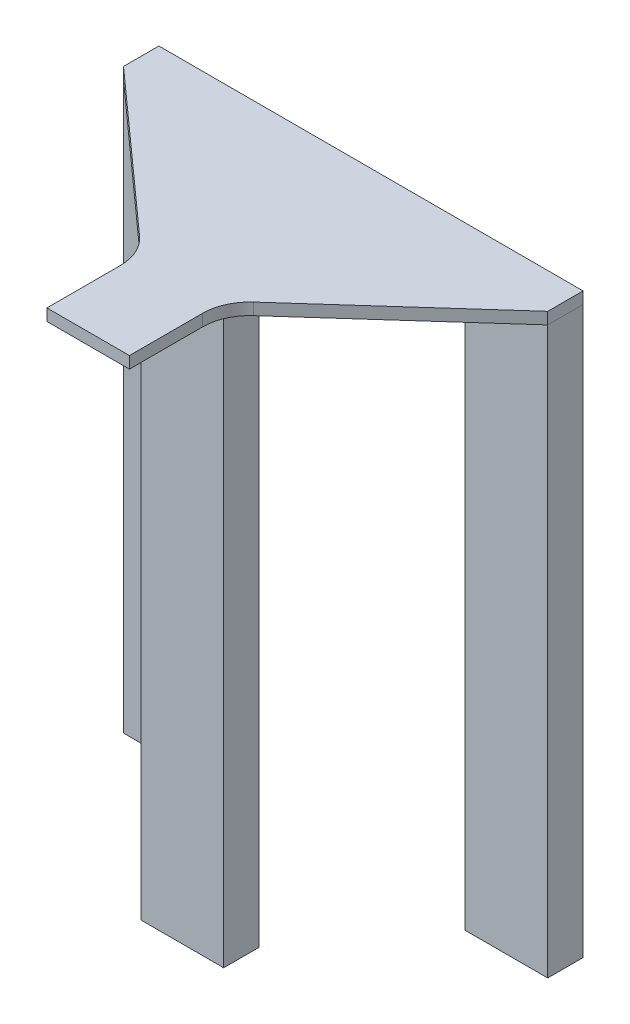
ISO-10303-21;
HEADER;
FILE_DESCRIPTION(('STEP AP214'),'2;1');
FILE_NAME('part.step','',(''),(''),'','','');
FILE_SCHEMA(('AUTOMOTIVE_DESIGN { 1 0 10303 214 1 1 1 1 }'));
ENDSEC;
DATA;
#1=APPLICATION_CONTEXT('core data for automotive mechanical design processes');
#2=APPLICATION_PROTOCOL_DEFINITION('international standard','automotive_design',2000,#1);
#3=PRODUCT_CONTEXT('',#1,'mechanical');
#4=PRODUCT('Part','Part','',(#3));
#5=PRODUCT_RELATED_PRODUCT_CATEGORY('part','',(#4));
#6=PRODUCT_DEFINITION_FORMATION('','',#4);
#7=PRODUCT_DEFINITION_CONTEXT('part definition',#1,'design');
#8=PRODUCT_DEFINITION('design','',#6,#7);
#9=PRODUCT_DEFINITION_SHAPE('','',#8);
#10=(LENGTH_UNIT() NAMED_UNIT(*) SI_UNIT(.MILLI.,.METRE.));
#11=(NAMED_UNIT(*) PLANE_ANGLE_UNIT() SI_UNIT($,.RADIAN.));
#12=(NAMED_UNIT(*) SI_UNIT($,.STERADIAN.) SOLID_ANGLE_UNIT());
#13=UNCERTAINTY_MEASURE_WITH_UNIT(LENGTH_MEASURE(1.E-05),#10,'distance_accuracy_value','');
#14=(GEOMETRIC_REPRESENTATION_CONTEXT(3) GLOBAL_UNCERTAINTY_ASSIGNED_CONTEXT((#13)) GLOBAL_UNIT_ASSIGNED_CONTEXT((#10,
#11,#12)) REPRESENTATION_CONTEXT('',''));
#15=CARTESIAN_POINT('',(0.,0.,0.));
#16=DIRECTION('',(0.,0.,1.));
#17=DIRECTION('',(1.,0.,0.));
#18=AXIS2_PLACEMENT_3D('',#15,#16,#17);
#19=CARTESIAN_POINT('',(0.,-609.6,-304.8));
#20=DIRECTION('',(0.,0.,1.));
#21=DIRECTION('',(1.,0.,0.));
#22=AXIS2_PLACEMENT_3D('',#19,#20,#21);
#23=PLANE('',#22);
#24=DIRECTION('',(1.,0.,0.));
#25=VECTOR('',#24,1.);
#26=CARTESIAN_POINT('',(0.,0.,-304.8));
#27=LINE('',#26,#25);
#28=CARTESIAN_POINT('',(139.7,0.,-304.8));
#29=VERTEX_POINT('',#28);
#30=CARTESIAN_POINT('',(228.6,0.,-304.8));
#31=VERTEX_POINT('',#30);
#32=EDGE_CURVE('E119',#29,#31,#27,.T.);
#33=ORIENTED_EDGE('',*,*,#32,.T.);
#34=DIRECTION('',(0.,1.,0.));
#35=VECTOR('',#34,1.);
#36=CARTESIAN_POINT('',(228.6,-609.6,-304.8));
#37=LINE('',#36,#35);
#38=CARTESIAN_POINT('',(228.6,-609.6,-304.8));
#39=VERTEX_POINT('',#38);
#40=EDGE_CURVE('E12',#39,#31,#37,.T.);
#41=ORIENTED_EDGE('',*,*,#40,.F.);
#42=DIRECTION('',(1.,0.,0.));
#43=VECTOR('',#42,1.);
#44=CARTESIAN_POINT('',(0.,-609.6,-304.8));
#45=LINE('',#44,#43);
#46=CARTESIAN_POINT('',(139.7,-609.6,-304.8));
#47=VERTEX_POINT('',#46);
#48=EDGE_CURVE('E112',#47,#39,#45,.T.);
#49=ORIENTED_EDGE('',*,*,#48,.F.);
#50=DIRECTION('',(0.,1.,0.));
#51=VECTOR('',#50,1.);
#52=CARTESIAN_POINT('',(139.7,-609.6,-304.8));
#53=LINE('',#52,#51);
#54=EDGE_CURVE('E54',#47,#29,#53,.T.);
#55=ORIENTED_EDGE('',*,*,#54,.T.);
#56=EDGE_LOOP('',(#33,#41,#49,#55));
#57=FACE_BOUND('',#56,.T.);
#58=ADVANCED_FACE('F55',(#57),#23,.F.);
#59=CARTESIAN_POINT('',(228.6,-609.6,0.));
#60=DIRECTION('',(-1.,0.,0.));
#61=DIRECTION('',(0.,0.,1.));
#62=AXIS2_PLACEMENT_3D('',#59,#60,#61);
#63=PLANE('',#62);
#64=DIRECTION('',(0.,0.,1.));
#65=VECTOR('',#64,1.);
#66=CARTESIAN_POINT('',(228.6,0.,0.));
#67=LINE('',#66,#65);
#68=CARTESIAN_POINT('',(228.6,0.,-266.7));
#69=VERTEX_POINT('',#68);
#70=EDGE_CURVE('E82',#31,#69,#67,.T.);
#71=ORIENTED_EDGE('',*,*,#70,.T.);
#72=DIRECTION('',(0.,1.,0.));
#73=VECTOR('',#72,1.);
#74=CARTESIAN_POINT('',(228.6,-609.6,-266.7));
#75=LINE('',#74,#73);
#76=CARTESIAN_POINT('',(228.6,-609.6,-266.7));
#77=VERTEX_POINT('',#76);
#78=EDGE_CURVE('E64',#77,#69,#75,.T.);
#79=ORIENTED_EDGE('',*,*,#78,.F.);
#80=DIRECTION('',(0.,0.,1.));
#81=VECTOR('',#80,1.);
#82=CARTESIAN_POINT('',(228.6,-609.6,0.));
#83=LINE('',#82,#81);
#84=EDGE_CURVE('E70',#39,#77,#83,.T.);
#85=ORIENTED_EDGE('',*,*,#84,.F.);
#86=ORIENTED_EDGE('',*,*,#40,.T.);
#87=EDGE_LOOP('',(#71,#79,#85,#86));
#88=FACE_BOUND('',#87,.T.);
#89=ADVANCED_FACE('F127',(#88),#63,.F.);
#90=CARTESIAN_POINT('',(-1.66533453693773E-13,-609.6,-266.7));
#91=DIRECTION('',(0.,0.,-1.));
#92=DIRECTION('',(-1.,0.,0.));
#93=AXIS2_PLACEMENT_3D('',#90,#91,#92);
#94=PLANE('',#93);
#95=DIRECTION('',(-1.,0.,0.));
#96=VECTOR('',#95,1.);
#97=CARTESIAN_POINT('',(-1.66533453693773E-13,0.,-266.7));
#98=LINE('',#97,#96);
#99=CARTESIAN_POINT('',(139.7,0.,-266.7));
#100=VERTEX_POINT('',#99);
#101=EDGE_CURVE('E107',#69,#100,#98,.T.);
#102=ORIENTED_EDGE('',*,*,#101,.T.);
#103=DIRECTION('',(0.,1.,0.));
#104=VECTOR('',#103,1.);
#105=CARTESIAN_POINT('',(139.7,-609.6,-266.7));
#106=LINE('',#105,#104);
#107=CARTESIAN_POINT('',(139.7,-609.6,-266.7));
#108=VERTEX_POINT('',#107);
#109=EDGE_CURVE('E106',#108,#100,#106,.T.);
#110=ORIENTED_EDGE('',*,*,#109,.F.);
#111=DIRECTION('',(-1.,0.,0.));
#112=VECTOR('',#111,1.);
#113=CARTESIAN_POINT('',(-1.66533453693773E-13,-609.6,-266.7));
#114=LINE('',#113,#112);
#115=EDGE_CURVE('E97',#77,#108,#114,.T.);
#116=ORIENTED_EDGE('',*,*,#115,.F.);
#117=ORIENTED_EDGE('',*,*,#78,.T.);
#118=EDGE_LOOP('',(#102,#110,#116,#117));
#119=FACE_BOUND('',#118,.T.);
#120=ADVANCED_FACE('F110',(#119),#94,.F.);
#121=CARTESIAN_POINT('',(139.7,-609.6,0.));
#122=DIRECTION('',(-1.,0.,0.));
#123=DIRECTION('',(0.,0.,1.));
#124=AXIS2_PLACEMENT_3D('',#121,#122,#123);
#125=PLANE('',#124);
#126=DIRECTION('',(0.,0.,1.));
#127=VECTOR('',#126,1.);
#128=CARTESIAN_POINT('',(139.7,0.,0.));
#129=LINE('',#128,#127);
#130=EDGE_CURVE('E118',#29,#100,#129,.T.);
#131=ORIENTED_EDGE('',*,*,#130,.F.);
#132=ORIENTED_EDGE('',*,*,#54,.F.);
#133=DIRECTION('',(0.,0.,1.));
#134=VECTOR('',#133,1.);
#135=CARTESIAN_POINT('',(139.7,-609.6,0.));
#136=LINE('',#135,#134);
#137=EDGE_CURVE('E105',#47,#108,#136,.T.);
#138=ORIENTED_EDGE('',*,*,#137,.T.);
#139=ORIENTED_EDGE('',*,*,#109,.T.);
#140=EDGE_LOOP('',(#131,#132,#138,#139));
#141=FACE_BOUND('',#140,.T.);
#142=ADVANCED_FACE('F109',(#141),#125,.T.);
#143=CARTESIAN_POINT('',(0.,-609.6,0.));
#144=DIRECTION('',(0.,1.,0.));
#145=DIRECTION('',(0.,0.,1.));
#146=AXIS2_PLACEMENT_3D('',#143,#144,#145);
#147=PLANE('',#146);
#148=ORIENTED_EDGE('',*,*,#48,.T.);
#149=ORIENTED_EDGE('',*,*,#84,.T.);
#150=ORIENTED_EDGE('',*,*,#115,.T.);
#151=ORIENTED_EDGE('',*,*,#137,.F.);
#152=EDGE_LOOP('',(#148,#149,#150,#151));
#153=FACE_BOUND('',#152,.T.);
#154=ADVANCED_FACE('F101',(#153),#147,.F.);
#155=CARTESIAN_POINT('',(0.,0.,0.));
#156=DIRECTION('',(0.,1.,0.));
#157=DIRECTION('',(0.,0.,1.));
#158=AXIS2_PLACEMENT_3D('',#155,#156,#157);
#159=PLANE('',#158);
#160=ORIENTED_EDGE('',*,*,#32,.F.);
#161=ORIENTED_EDGE('',*,*,#130,.T.);
#162=ORIENTED_EDGE('',*,*,#101,.F.);
#163=ORIENTED_EDGE('',*,*,#70,.F.);
#164=EDGE_LOOP('',(#160,#161,#162,#163));
#165=FACE_BOUND('',#164,.T.);
#166=ADVANCED_FACE('F122',(#165),#159,.T.);
#167=CLOSED_SHELL('',(#58,#89,#120,#142,#154,#166));
#168=MANIFOLD_SOLID_BREP('B2',#167);
#169=CARTESIAN_POINT('',(44.4499999999999,-609.6,0.));
#170=DIRECTION('',(-1.,0.,0.));
#171=DIRECTION('',(0.,0.,1.));
#172=AXIS2_PLACEMENT_3D('',#169,#170,#171);
#173=PLANE('',#172);
#174=DIRECTION('',(0.,0.,1.));
#175=VECTOR('',#174,1.);
#176=CARTESIAN_POINT('',(44.4499999999999,0.,0.));
#177=LINE('',#176,#175);
#178=CARTESIAN_POINT('',(44.45,0.,-139.7));
#179=VERTEX_POINT('',#178);
#180=CARTESIAN_POINT('',(44.45,0.,-101.6));
#181=VERTEX_POINT('',#180);
#182=EDGE_CURVE('E255',#179,#181,#177,.T.);
#183=ORIENTED_EDGE('',*,*,#182,.T.);
#184=DIRECTION('',(0.,1.,0.));
#185=VECTOR('',#184,1.);
#186=CARTESIAN_POINT('',(44.45,-609.6,-101.6));
#187=LINE('',#186,#185);
#188=CARTESIAN_POINT('',(44.45,-609.6,-101.6));
#189=VERTEX_POINT('',#188);
#190=EDGE_CURVE('E49',#189,#181,#187,.T.);
#191=ORIENTED_EDGE('',*,*,#190,.F.);
#192=DIRECTION('',(0.,0.,1.));
#193=VECTOR('',#192,1.);
#194=CARTESIAN_POINT('',(44.4499999999999,-609.6,0.));
#195=LINE('',#194,#193);
#196=CARTESIAN_POINT('',(44.45,-609.6,-139.7));
#197=VERTEX_POINT('',#196);
#198=EDGE_CURVE('E209',#197,#189,#195,.T.);
#199=ORIENTED_EDGE('',*,*,#198,.F.);
#200=DIRECTION('',(0.,1.,0.));
#201=VECTOR('',#200,1.);
#202=CARTESIAN_POINT('',(44.45,-609.6,-139.7));
#203=LINE('',#202,#201);
#204=EDGE_CURVE('E191',#197,#179,#203,.T.);
#205=ORIENTED_EDGE('',*,*,#204,.T.);
#206=EDGE_LOOP('',(#183,#191,#199,#205));
#207=FACE_BOUND('',#206,.T.);
#208=ADVANCED_FACE('F194',(#207),#173,.F.);
#209=CARTESIAN_POINT('',(0.,-609.6,-101.6));
#210=DIRECTION('',(0.,0.,1.));
#211=DIRECTION('',(1.,0.,0.));
#212=AXIS2_PLACEMENT_3D('',#209,#210,#211);
#213=PLANE('',#212);
#214=DIRECTION('',(1.,0.,0.));
#215=VECTOR('',#214,1.);
#216=CARTESIAN_POINT('',(0.,0.,-101.6));
#217=LINE('',#216,#215);
#218=CARTESIAN_POINT('',(-44.45,0.,-101.6));
#219=VERTEX_POINT('',#218);
#220=EDGE_CURVE('E259',#219,#181,#217,.T.);
#221=ORIENTED_EDGE('',*,*,#220,.F.);
#222=DIRECTION('',(0.,1.,0.));
#223=VECTOR('',#222,1.);
#224=CARTESIAN_POINT('',(-44.45,-609.6,-101.6));
#225=LINE('',#224,#223);
#226=CARTESIAN_POINT('',(-44.45,-609.6,-101.6));
#227=VERTEX_POINT('',#226);
#228=EDGE_CURVE('E203',#227,#219,#225,.T.);
#229=ORIENTED_EDGE('',*,*,#228,.F.);
#230=DIRECTION('',(1.,0.,0.));
#231=VECTOR('',#230,1.);
#232=CARTESIAN_POINT('',(0.,-609.6,-101.6));
#233=LINE('',#232,#231);
#234=EDGE_CURVE('E250',#227,#189,#233,.T.);
#235=ORIENTED_EDGE('',*,*,#234,.T.);
#236=ORIENTED_EDGE('',*,*,#190,.T.);
#237=EDGE_LOOP('',(#221,#229,#235,#236));
#238=FACE_BOUND('',#237,.T.);
#239=ADVANCED_FACE('F264',(#238),#213,.T.);
#240=CARTESIAN_POINT('',(-44.45,-609.6,0.));
#241=DIRECTION('',(-1.,0.,0.));
#242=DIRECTION('',(0.,0.,1.));
#243=AXIS2_PLACEMENT_3D('',#240,#241,#242);
#244=PLANE('',#243);
#245=DIRECTION('',(0.,0.,1.));
#246=VECTOR('',#245,1.);
#247=CARTESIAN_POINT('',(-44.45,0.,0.));
#248=LINE('',#247,#246);
#249=CARTESIAN_POINT('',(-44.45,0.,-139.7));
#250=VERTEX_POINT('',#249);
#251=EDGE_CURVE('E241',#250,#219,#248,.T.);
#252=ORIENTED_EDGE('',*,*,#251,.F.);
#253=DIRECTION('',(0.,1.,0.));
#254=VECTOR('',#253,1.);
#255=CARTESIAN_POINT('',(-44.45,-609.6,-139.7));
#256=LINE('',#255,#254);
#257=CARTESIAN_POINT('',(-44.45,-609.6,-139.7));
#258=VERTEX_POINT('',#257);
#259=EDGE_CURVE('E239',#258,#250,#256,.T.);
#260=ORIENTED_EDGE('',*,*,#259,.F.);
#261=DIRECTION('',(0.,0.,1.));
#262=VECTOR('',#261,1.);
#263=CARTESIAN_POINT('',(-44.45,-609.6,0.));
#264=LINE('',#263,#262);
#265=EDGE_CURVE('E244',#258,#227,#264,.T.);
#266=ORIENTED_EDGE('',*,*,#265,.T.);
#267=ORIENTED_EDGE('',*,*,#228,.T.);
#268=EDGE_LOOP('',(#252,#260,#266,#267));
#269=FACE_BOUND('',#268,.T.);
#270=ADVANCED_FACE('F238',(#269),#244,.T.);
#271=CARTESIAN_POINT('',(0.,-609.6,-139.7));
#272=DIRECTION('',(0.,0.,1.));
#273=DIRECTION('',(1.,0.,0.));
#274=AXIS2_PLACEMENT_3D('',#271,#272,#273);
#275=PLANE('',#274);
#276=DIRECTION('',(1.,0.,0.));
#277=VECTOR('',#276,1.);
#278=CARTESIAN_POINT('',(0.,0.,-139.7));
#279=LINE('',#278,#277);
#280=EDGE_CURVE('E258',#250,#179,#279,.T.);
#281=ORIENTED_EDGE('',*,*,#280,.T.);
#282=ORIENTED_EDGE('',*,*,#204,.F.);
#283=DIRECTION('',(1.,0.,0.));
#284=VECTOR('',#283,1.);
#285=CARTESIAN_POINT('',(0.,-609.6,-139.7));
#286=LINE('',#285,#284);
#287=EDGE_CURVE('E237',#258,#197,#286,.T.);
#288=ORIENTED_EDGE('',*,*,#287,.F.);
#289=ORIENTED_EDGE('',*,*,#259,.T.);
#290=EDGE_LOOP('',(#281,#282,#288,#289));
#291=FACE_BOUND('',#290,.T.);
#292=ADVANCED_FACE('F242',(#291),#275,.F.);
#293=CARTESIAN_POINT('',(0.,-609.6,0.));
#294=DIRECTION('',(0.,1.,0.));
#295=DIRECTION('',(0.,0.,1.));
#296=AXIS2_PLACEMENT_3D('',#293,#294,#295);
#297=PLANE('',#296);
#298=ORIENTED_EDGE('',*,*,#198,.T.);
#299=ORIENTED_EDGE('',*,*,#234,.F.);
#300=ORIENTED_EDGE('',*,*,#265,.F.);
#301=ORIENTED_EDGE('',*,*,#287,.T.);
#302=EDGE_LOOP('',(#298,#299,#300,#301));
#303=FACE_BOUND('',#302,.T.);
#304=ADVANCED_FACE('F247',(#303),#297,.F.);
#305=CARTESIAN_POINT('',(0.,0.,0.));
#306=DIRECTION('',(0.,1.,0.));
#307=DIRECTION('',(0.,0.,1.));
#308=AXIS2_PLACEMENT_3D('',#305,#306,#307);
#309=PLANE('',#308);
#310=ORIENTED_EDGE('',*,*,#182,.F.);
#311=ORIENTED_EDGE('',*,*,#280,.F.);
#312=ORIENTED_EDGE('',*,*,#251,.T.);
#313=ORIENTED_EDGE('',*,*,#220,.T.);
#314=EDGE_LOOP('',(#310,#311,#312,#313));
#315=FACE_BOUND('',#314,.T.);
#316=ADVANCED_FACE('F262',(#315),#309,.T.);
#317=CLOSED_SHELL('',(#208,#239,#270,#292,#304,#316));
#318=MANIFOLD_SOLID_BREP('B6',#317);
#319=CARTESIAN_POINT('',(-139.7,-609.6,0.));
#320=DIRECTION('',(-1.,0.,0.));
#321=DIRECTION('',(0.,0.,1.));
#322=AXIS2_PLACEMENT_3D('',#319,#320,#321);
#323=PLANE('',#322);
#324=DIRECTION('',(0.,0.,1.));
#325=VECTOR('',#324,1.);
#326=CARTESIAN_POINT('',(-139.7,0.,0.));
#327=LINE('',#326,#325);
#328=CARTESIAN_POINT('',(-139.7,0.,-304.8));
#329=VERTEX_POINT('',#328);
#330=CARTESIAN_POINT('',(-139.7,0.,-266.7));
#331=VERTEX_POINT('',#330);
#332=EDGE_CURVE('E390',#329,#331,#327,.T.);
#333=ORIENTED_EDGE('',*,*,#332,.T.);
#334=DIRECTION('',(0.,1.,0.));
#335=VECTOR('',#334,1.);
#336=CARTESIAN_POINT('',(-139.7,-609.6,-266.7));
#337=LINE('',#336,#335);
#338=CARTESIAN_POINT('',(-139.7,-609.6,-266.7));
#339=VERTEX_POINT('',#338);
#340=EDGE_CURVE('E187',#339,#331,#337,.T.);
#341=ORIENTED_EDGE('',*,*,#340,.F.);
#342=DIRECTION('',(0.,0.,1.));
#343=VECTOR('',#342,1.);
#344=CARTESIAN_POINT('',(-139.7,-609.6,0.));
#345=LINE('',#344,#343);
#346=CARTESIAN_POINT('',(-139.7,-609.6,-304.8));
#347=VERTEX_POINT('',#346);
#348=EDGE_CURVE('E342',#347,#339,#345,.T.);
#349=ORIENTED_EDGE('',*,*,#348,.F.);
#350=DIRECTION('',(0.,1.,0.));
#351=VECTOR('',#350,1.);
#352=CARTESIAN_POINT('',(-139.7,-609.6,-304.8));
#353=LINE('',#352,#351);
#354=EDGE_CURVE('E327',#347,#329,#353,.T.);
#355=ORIENTED_EDGE('',*,*,#354,.T.);
#356=EDGE_LOOP('',(#333,#341,#349,#355));
#357=FACE_BOUND('',#356,.T.);
#358=ADVANCED_FACE('F324',(#357),#323,.F.);
#359=CARTESIAN_POINT('',(0.,-609.6,-266.7));
#360=DIRECTION('',(0.,0.,1.));
#361=DIRECTION('',(1.,0.,0.));
#362=AXIS2_PLACEMENT_3D('',#359,#360,#361);
#363=PLANE('',#362);
#364=DIRECTION('',(1.,0.,0.));
#365=VECTOR('',#364,1.);
#366=CARTESIAN_POINT('',(0.,0.,-266.7));
#367=LINE('',#366,#365);
#368=CARTESIAN_POINT('',(-228.6,0.,-266.7));
#369=VERTEX_POINT('',#368);
#370=EDGE_CURVE('E391',#369,#331,#367,.T.);
#371=ORIENTED_EDGE('',*,*,#370,.F.);
#372=DIRECTION('',(0.,1.,0.));
#373=VECTOR('',#372,1.);
#374=CARTESIAN_POINT('',(-228.6,-609.6,-266.7));
#375=LINE('',#374,#373);
#376=CARTESIAN_POINT('',(-228.6,-609.6,-266.7));
#377=VERTEX_POINT('',#376);
#378=EDGE_CURVE('E331',#377,#369,#375,.T.);
#379=ORIENTED_EDGE('',*,*,#378,.F.);
#380=DIRECTION('',(1.,0.,0.));
#381=VECTOR('',#380,1.);
#382=CARTESIAN_POINT('',(0.,-609.6,-266.7));
#383=LINE('',#382,#381);
#384=EDGE_CURVE('E385',#377,#339,#383,.T.);
#385=ORIENTED_EDGE('',*,*,#384,.T.);
#386=ORIENTED_EDGE('',*,*,#340,.T.);
#387=EDGE_LOOP('',(#371,#379,#385,#386));
#388=FACE_BOUND('',#387,.T.);
#389=ADVANCED_FACE('F397',(#388),#363,.T.);
#390=CARTESIAN_POINT('',(-228.6,-609.6,0.));
#391=DIRECTION('',(-1.,0.,0.));
#392=DIRECTION('',(0.,0.,1.));
#393=AXIS2_PLACEMENT_3D('',#390,#391,#392);
#394=PLANE('',#393);
#395=DIRECTION('',(0.,0.,1.));
#396=VECTOR('',#395,1.);
#397=CARTESIAN_POINT('',(-228.6,0.,0.));
#398=LINE('',#397,#396);
#399=CARTESIAN_POINT('',(-228.6,0.,-304.8));
#400=VERTEX_POINT('',#399);
#401=EDGE_CURVE('E374',#400,#369,#398,.T.);
#402=ORIENTED_EDGE('',*,*,#401,.F.);
#403=DIRECTION('',(0.,1.,0.));
#404=VECTOR('',#403,1.);
#405=CARTESIAN_POINT('',(-228.6,-609.6,-304.8));
#406=LINE('',#405,#404);
#407=CARTESIAN_POINT('',(-228.6,-609.6,-304.8));
#408=VERTEX_POINT('',#407);
#409=EDGE_CURVE('E375',#408,#400,#406,.T.);
#410=ORIENTED_EDGE('',*,*,#409,.F.);
#411=DIRECTION('',(0.,0.,1.));
#412=VECTOR('',#411,1.);
#413=CARTESIAN_POINT('',(-228.6,-609.6,0.));
#414=LINE('',#413,#412);
#415=EDGE_CURVE('E372',#408,#377,#414,.T.);
#416=ORIENTED_EDGE('',*,*,#415,.T.);
#417=ORIENTED_EDGE('',*,*,#378,.T.);
#418=EDGE_LOOP('',(#402,#410,#416,#417));
#419=FACE_BOUND('',#418,.T.);
#420=ADVANCED_FACE('F373',(#419),#394,.T.);
#421=CARTESIAN_POINT('',(0.,-609.6,-304.8));
#422=DIRECTION('',(0.,0.,1.));
#423=DIRECTION('',(1.,0.,0.));
#424=AXIS2_PLACEMENT_3D('',#421,#422,#423);
#425=PLANE('',#424);
#426=DIRECTION('',(1.,0.,0.));
#427=VECTOR('',#426,1.);
#428=CARTESIAN_POINT('',(0.,0.,-304.8));
#429=LINE('',#428,#427);
#430=EDGE_CURVE('E386',#400,#329,#429,.T.);
#431=ORIENTED_EDGE('',*,*,#430,.T.);
#432=ORIENTED_EDGE('',*,*,#354,.F.);
#433=DIRECTION('',(1.,0.,0.));
#434=VECTOR('',#433,1.);
#435=CARTESIAN_POINT('',(0.,-609.6,-304.8));
#436=LINE('',#435,#434);
#437=EDGE_CURVE('E369',#408,#347,#436,.T.);
#438=ORIENTED_EDGE('',*,*,#437,.F.);
#439=ORIENTED_EDGE('',*,*,#409,.T.);
#440=EDGE_LOOP('',(#431,#432,#438,#439));
#441=FACE_BOUND('',#440,.T.);
#442=ADVANCED_FACE('F378',(#441),#425,.F.);
#443=CARTESIAN_POINT('',(0.,-609.6,0.));
#444=DIRECTION('',(0.,1.,0.));
#445=DIRECTION('',(0.,0.,1.));
#446=AXIS2_PLACEMENT_3D('',#443,#444,#445);
#447=PLANE('',#446);
#448=ORIENTED_EDGE('',*,*,#348,.T.);
#449=ORIENTED_EDGE('',*,*,#384,.F.);
#450=ORIENTED_EDGE('',*,*,#415,.F.);
#451=ORIENTED_EDGE('',*,*,#437,.T.);
#452=EDGE_LOOP('',(#448,#449,#450,#451));
#453=FACE_BOUND('',#452,.T.);
#454=ADVANCED_FACE('F381',(#453),#447,.F.);
#455=CARTESIAN_POINT('',(0.,0.,0.));
#456=DIRECTION('',(0.,1.,0.));
#457=DIRECTION('',(0.,0.,1.));
#458=AXIS2_PLACEMENT_3D('',#455,#456,#457);
#459=PLANE('',#458);
#460=ORIENTED_EDGE('',*,*,#332,.F.);
#461=ORIENTED_EDGE('',*,*,#430,.F.);
#462=ORIENTED_EDGE('',*,*,#401,.T.);
#463=ORIENTED_EDGE('',*,*,#370,.T.);
#464=EDGE_LOOP('',(#460,#461,#462,#463));
#465=FACE_BOUND('',#464,.T.);
#466=ADVANCED_FACE('F399',(#465),#459,.T.);
#467=CLOSED_SHELL('',(#358,#389,#420,#442,#454,#466));
#468=MANIFOLD_SOLID_BREP('B42',#467);
#469=CARTESIAN_POINT('',(30.6909690177983,12.7,-34.2322346736981));
#470=DIRECTION('',(0.667545015752026,0.,-0.74456944064649));
#471=DIRECTION('',(-0.744569440646491,0.,-0.667545015752026));
#472=AXIS2_PLACEMENT_3D('',#469,#470,#471);
#473=PLANE('',#472);
#474=DIRECTION('',(0.744569440646491,0.,0.667545015752026));
#475=VECTOR('',#474,1.);
#476=CARTESIAN_POINT('',(30.6909690177983,0.,-34.2322346736981));
#477=LINE('',#476,#475);
#478=CARTESIAN_POINT('',(-228.6,0.,-266.7));
#479=VERTEX_POINT('',#478);
#480=CARTESIAN_POINT('',(-61.3387131997971,0.,-116.741604937749));
#481=VERTEX_POINT('',#480);
#482=EDGE_CURVE('E575',#479,#481,#477,.T.);
#483=ORIENTED_EDGE('',*,*,#482,.T.);
#484=DIRECTION('',(0.,-1.,0.));
#485=VECTOR('',#484,1.);
#486=CARTESIAN_POINT('',(-61.3387131997971,12.7,-116.741604937749));
#487=LINE('',#486,#485);
#488=CARTESIAN_POINT('',(-61.3387131997971,12.7,-116.741604937749));
#489=VERTEX_POINT('',#488);
#490=EDGE_CURVE('E466',#481,#489,#487,.F.);
#491=ORIENTED_EDGE('',*,*,#490,.T.);
#492=DIRECTION('',(0.744569440646491,0.,0.667545015752026));
#493=VECTOR('',#492,1.);
#494=CARTESIAN_POINT('',(30.6909690177983,12.7,-34.2322346736981));
#495=LINE('',#494,#493);
#496=CARTESIAN_POINT('',(-228.6,12.7,-266.7));
#497=VERTEX_POINT('',#496);
#498=EDGE_CURVE('E543',#497,#489,#495,.T.);
#499=ORIENTED_EDGE('',*,*,#498,.F.);
#500=DIRECTION('',(0.,-1.,0.));
#501=VECTOR('',#500,1.);
#502=CARTESIAN_POINT('',(-228.6,12.7,-266.7));
#503=LINE('',#502,#501);
#504=EDGE_CURVE('E571',#497,#479,#503,.T.);
#505=ORIENTED_EDGE('',*,*,#504,.T.);
#506=EDGE_LOOP('',(#483,#491,#499,#505));
#507=FACE_BOUND('',#506,.T.);
#508=ADVANCED_FACE('F451',(#507),#473,.F.);
#509=CARTESIAN_POINT('',(-44.45,12.7,0.));
#510=DIRECTION('',(1.,0.,0.));
#511=DIRECTION('',(0.,0.,-1.));
#512=AXIS2_PLACEMENT_3D('',#509,#510,#511);
#513=PLANE('',#512);
#514=DIRECTION('',(0.,0.,1.));
#515=VECTOR('',#514,1.);
#516=CARTESIAN_POINT('',(-44.45,12.7,0.));
#517=LINE('',#516,#515);
#518=CARTESIAN_POINT('',(-44.45,12.7,-78.9174773529074));
#519=VERTEX_POINT('',#518);
#520=CARTESIAN_POINT('',(-44.45,12.7,0.));
#521=VERTEX_POINT('',#520);
#522=EDGE_CURVE('E535',#519,#521,#517,.T.);
#523=ORIENTED_EDGE('',*,*,#522,.F.);
#524=DIRECTION('',(0.,-1.,0.));
#525=VECTOR('',#524,1.);
#526=CARTESIAN_POINT('',(-44.45,0.,-78.9174773529074));
#527=LINE('',#526,#525);
#528=CARTESIAN_POINT('',(-44.45,0.,-78.9174773529074));
#529=VERTEX_POINT('',#528);
#530=EDGE_CURVE('E603',#519,#529,#527,.T.);
#531=ORIENTED_EDGE('',*,*,#530,.T.);
#532=DIRECTION('',(0.,0.,1.));
#533=VECTOR('',#532,1.);
#534=CARTESIAN_POINT('',(-44.45,0.,0.));
#535=LINE('',#534,#533);
#536=CARTESIAN_POINT('',(-44.45,0.,0.));
#537=VERTEX_POINT('',#536);
#538=EDGE_CURVE('E547',#529,#537,#535,.T.);
#539=ORIENTED_EDGE('',*,*,#538,.T.);
#540=DIRECTION('',(0.,-1.,0.));
#541=VECTOR('',#540,1.);
#542=CARTESIAN_POINT('',(-44.45,12.7,0.));
#543=LINE('',#542,#541);
#544=EDGE_CURVE('E546',#521,#537,#543,.T.);
#545=ORIENTED_EDGE('',*,*,#544,.F.);
#546=EDGE_LOOP('',(#523,#531,#539,#545));
#547=FACE_BOUND('',#546,.T.);
#548=ADVANCED_FACE('F550',(#547),#513,.F.);
#549=CARTESIAN_POINT('',(0.,12.7,0.));
#550=DIRECTION('',(0.,0.,-1.));
#551=DIRECTION('',(-1.,0.,0.));
#552=AXIS2_PLACEMENT_3D('',#549,#550,#551);
#553=PLANE('',#552);
#554=DIRECTION('',(1.,0.,0.));
#555=VECTOR('',#554,1.);
#556=CARTESIAN_POINT('',(0.,0.,0.));
#557=LINE('',#556,#555);
#558=CARTESIAN_POINT('',(44.45,0.,0.));
#559=VERTEX_POINT('',#558);
#560=EDGE_CURVE('E578',#537,#559,#557,.T.);
#561=ORIENTED_EDGE('',*,*,#560,.T.);
#562=DIRECTION('',(0.,-1.,0.));
#563=VECTOR('',#562,1.);
#564=CARTESIAN_POINT('',(44.45,12.7,0.));
#565=LINE('',#564,#563);
#566=CARTESIAN_POINT('',(44.45,12.7,0.));
#567=VERTEX_POINT('',#566);
#568=EDGE_CURVE('E554',#567,#559,#565,.T.);
#569=ORIENTED_EDGE('',*,*,#568,.F.);
#570=DIRECTION('',(1.,0.,0.));
#571=VECTOR('',#570,1.);
#572=CARTESIAN_POINT('',(0.,12.7,0.));
#573=LINE('',#572,#571);
#574=EDGE_CURVE('E540',#521,#567,#573,.T.);
#575=ORIENTED_EDGE('',*,*,#574,.F.);
#576=ORIENTED_EDGE('',*,*,#544,.T.);
#577=EDGE_LOOP('',(#561,#569,#575,#576));
#578=FACE_BOUND('',#577,.T.);
#579=ADVANCED_FACE('F553',(#578),#553,.F.);
#580=CARTESIAN_POINT('',(44.45,12.7,0.));
#581=DIRECTION('',(1.,0.,0.));
#582=DIRECTION('',(0.,0.,-1.));
#583=AXIS2_PLACEMENT_3D('',#580,#581,#582);
#584=PLANE('',#583);
#585=DIRECTION('',(0.,0.,1.));
#586=VECTOR('',#585,1.);
#587=CARTESIAN_POINT('',(44.45,0.,0.));
#588=LINE('',#587,#586);
#589=CARTESIAN_POINT('',(44.45,0.,-78.9174773529074));
#590=VERTEX_POINT('',#589);
#591=EDGE_CURVE('E577',#590,#559,#588,.T.);
#592=ORIENTED_EDGE('',*,*,#591,.F.);
#593=DIRECTION('',(0.,-1.,0.));
#594=VECTOR('',#593,1.);
#595=CARTESIAN_POINT('',(44.45,12.7,-78.9174773529074));
#596=LINE('',#595,#594);
#597=CARTESIAN_POINT('',(44.45,12.7,-78.9174773529074));
#598=VERTEX_POINT('',#597);
#599=EDGE_CURVE('E605',#590,#598,#596,.F.);
#600=ORIENTED_EDGE('',*,*,#599,.T.);
#601=DIRECTION('',(0.,0.,1.));
#602=VECTOR('',#601,1.);
#603=CARTESIAN_POINT('',(44.45,12.7,0.));
#604=LINE('',#603,#602);
#605=EDGE_CURVE('E556',#598,#567,#604,.T.);
#606=ORIENTED_EDGE('',*,*,#605,.T.);
#607=ORIENTED_EDGE('',*,*,#568,.T.);
#608=EDGE_LOOP('',(#592,#600,#606,#607));
#609=FACE_BOUND('',#608,.T.);
#610=ADVANCED_FACE('F624',(#609),#584,.T.);
#611=CARTESIAN_POINT('',(-30.6909690177983,12.7,-34.2322346736981));
#612=DIRECTION('',(-0.667545015752026,0.,-0.74456944064649));
#613=DIRECTION('',(-0.74456944064649,0.,0.667545015752026));
#614=AXIS2_PLACEMENT_3D('',#611,#612,#613);
#615=PLANE('',#614);
#616=DIRECTION('',(0.74456944064649,0.,-0.667545015752026));
#617=VECTOR('',#616,1.);
#618=CARTESIAN_POINT('',(-30.6909690177983,12.7,-34.2322346736981));
#619=LINE('',#618,#617);
#620=CARTESIAN_POINT('',(61.3387131997971,12.7,-116.741604937749));
#621=VERTEX_POINT('',#620);
#622=CARTESIAN_POINT('',(228.6,12.7,-266.7));
#623=VERTEX_POINT('',#622);
#624=EDGE_CURVE('E558',#621,#623,#619,.T.);
#625=ORIENTED_EDGE('',*,*,#624,.F.);
#626=DIRECTION('',(0.,-1.,0.));
#627=VECTOR('',#626,1.);
#628=CARTESIAN_POINT('',(61.3387131997971,12.7,-116.741604937749));
#629=LINE('',#628,#627);
#630=CARTESIAN_POINT('',(61.3387131997971,0.,-116.741604937749));
#631=VERTEX_POINT('',#630);
#632=EDGE_CURVE('E555',#621,#631,#629,.T.);
#633=ORIENTED_EDGE('',*,*,#632,.T.);
#634=DIRECTION('',(0.74456944064649,0.,-0.667545015752026));
#635=VECTOR('',#634,1.);
#636=CARTESIAN_POINT('',(-30.6909690177983,0.,-34.2322346736981));
#637=LINE('',#636,#635);
#638=CARTESIAN_POINT('',(228.6,0.,-266.7));
#639=VERTEX_POINT('',#638);
#640=EDGE_CURVE('E576',#631,#639,#637,.T.);
#641=ORIENTED_EDGE('',*,*,#640,.T.);
#642=DIRECTION('',(0.,-1.,0.));
#643=VECTOR('',#642,1.);
#644=CARTESIAN_POINT('',(228.6,12.7,-266.7));
#645=LINE('',#644,#643);
#646=EDGE_CURVE('E596',#623,#639,#645,.T.);
#647=ORIENTED_EDGE('',*,*,#646,.F.);
#648=EDGE_LOOP('',(#625,#633,#641,#647));
#649=FACE_BOUND('',#648,.T.);
#650=ADVANCED_FACE('F617',(#649),#615,.F.);
#651=CARTESIAN_POINT('',(228.6,12.7,0.));
#652=DIRECTION('',(1.,0.,0.));
#653=DIRECTION('',(0.,0.,-1.));
#654=AXIS2_PLACEMENT_3D('',#651,#652,#653);
#655=PLANE('',#654);
#656=DIRECTION('',(0.,0.,1.));
#657=VECTOR('',#656,1.);
#658=CARTESIAN_POINT('',(228.6,0.,0.));
#659=LINE('',#658,#657);
#660=CARTESIAN_POINT('',(228.6,0.,-304.8));
#661=VERTEX_POINT('',#660);
#662=EDGE_CURVE('E582',#661,#639,#659,.T.);
#663=ORIENTED_EDGE('',*,*,#662,.F.);
#664=DIRECTION('',(0.,-1.,0.));
#665=VECTOR('',#664,1.);
#666=CARTESIAN_POINT('',(228.6,12.7,-304.8));
#667=LINE('',#666,#665);
#668=CARTESIAN_POINT('',(228.6,12.7,-304.8));
#669=VERTEX_POINT('',#668);
#670=EDGE_CURVE('E592',#669,#661,#667,.T.);
#671=ORIENTED_EDGE('',*,*,#670,.F.);
#672=DIRECTION('',(0.,0.,1.));
#673=VECTOR('',#672,1.);
#674=CARTESIAN_POINT('',(228.6,12.7,0.));
#675=LINE('',#674,#673);
#676=EDGE_CURVE('E565',#669,#623,#675,.T.);
#677=ORIENTED_EDGE('',*,*,#676,.T.);
#678=ORIENTED_EDGE('',*,*,#646,.T.);
#679=EDGE_LOOP('',(#663,#671,#677,#678));
#680=FACE_BOUND('',#679,.T.);
#681=ADVANCED_FACE('F633',(#680),#655,.T.);
#682=CARTESIAN_POINT('',(0.,12.7,-304.8));
#683=DIRECTION('',(0.,0.,-1.));
#684=DIRECTION('',(-1.,0.,0.));
#685=AXIS2_PLACEMENT_3D('',#682,#683,#684);
#686=PLANE('',#685);
#687=DIRECTION('',(1.,0.,0.));
#688=VECTOR('',#687,1.);
#689=CARTESIAN_POINT('',(0.,0.,-304.8));
#690=LINE('',#689,#688);
#691=CARTESIAN_POINT('',(-228.6,0.,-304.8));
#692=VERTEX_POINT('',#691);
#693=EDGE_CURVE('E584',#692,#661,#690,.T.);
#694=ORIENTED_EDGE('',*,*,#693,.F.);
#695=DIRECTION('',(0.,-1.,0.));
#696=VECTOR('',#695,1.);
#697=CARTESIAN_POINT('',(-228.6,12.7,-304.8));
#698=LINE('',#697,#696);
#699=CARTESIAN_POINT('',(-228.6,12.7,-304.8));
#700=VERTEX_POINT('',#699);
#701=EDGE_CURVE('E595',#700,#692,#698,.T.);
#702=ORIENTED_EDGE('',*,*,#701,.F.);
#703=DIRECTION('',(1.,0.,0.));
#704=VECTOR('',#703,1.);
#705=CARTESIAN_POINT('',(0.,12.7,-304.8));
#706=LINE('',#705,#704);
#707=EDGE_CURVE('E570',#700,#669,#706,.T.);
#708=ORIENTED_EDGE('',*,*,#707,.T.);
#709=ORIENTED_EDGE('',*,*,#670,.T.);
#710=EDGE_LOOP('',(#694,#702,#708,#709));
#711=FACE_BOUND('',#710,.T.);
#712=ADVANCED_FACE('F654',(#711),#686,.T.);
#713=CARTESIAN_POINT('',(-228.6,12.7,0.));
#714=DIRECTION('',(1.,0.,0.));
#715=DIRECTION('',(0.,0.,-1.));
#716=AXIS2_PLACEMENT_3D('',#713,#714,#715);
#717=PLANE('',#716);
#718=DIRECTION('',(0.,0.,1.));
#719=VECTOR('',#718,1.);
#720=CARTESIAN_POINT('',(-228.6,0.,0.));
#721=LINE('',#720,#719);
#722=EDGE_CURVE('E586',#692,#479,#721,.T.);
#723=ORIENTED_EDGE('',*,*,#722,.T.);
#724=ORIENTED_EDGE('',*,*,#504,.F.);
#725=DIRECTION('',(0.,0.,1.));
#726=VECTOR('',#725,1.);
#727=CARTESIAN_POINT('',(-228.6,12.7,0.));
#728=LINE('',#727,#726);
#729=EDGE_CURVE('E568',#700,#497,#728,.T.);
#730=ORIENTED_EDGE('',*,*,#729,.F.);
#731=ORIENTED_EDGE('',*,*,#701,.T.);
#732=EDGE_LOOP('',(#723,#724,#730,#731));
#733=FACE_BOUND('',#732,.T.);
#734=ADVANCED_FACE('F651',(#733),#717,.F.);
#735=CARTESIAN_POINT('',(0.,12.7,0.));
#736=DIRECTION('',(0.,1.,0.));
#737=DIRECTION('',(0.,0.,1.));
#738=AXIS2_PLACEMENT_3D('',#735,#736,#737);
#739=PLANE('',#738);
#740=ORIENTED_EDGE('',*,*,#498,.T.);
#741=CARTESIAN_POINT('',(-95.25,12.7,-78.9174773529074));
#742=DIRECTION('',(0.,1.,0.));
#743=DIRECTION('',(0.,0.,1.));
#744=AXIS2_PLACEMENT_3D('',#741,#742,#743);
#745=CIRCLE('',#744,50.8);
#746=EDGE_CURVE('E323',#489,#519,#745,.F.);
#747=ORIENTED_EDGE('',*,*,#746,.T.);
#748=ORIENTED_EDGE('',*,*,#522,.T.);
#749=ORIENTED_EDGE('',*,*,#574,.T.);
#750=ORIENTED_EDGE('',*,*,#605,.F.);
#751=CARTESIAN_POINT('',(95.25,12.7,-78.9174773529074));
#752=DIRECTION('',(0.,1.,0.));
#753=DIRECTION('',(0.,0.,1.));
#754=AXIS2_PLACEMENT_3D('',#751,#752,#753);
#755=CIRCLE('',#754,50.8);
#756=EDGE_CURVE('E606',#598,#621,#755,.F.);
#757=ORIENTED_EDGE('',*,*,#756,.T.);
#758=ORIENTED_EDGE('',*,*,#624,.T.);
#759=ORIENTED_EDGE('',*,*,#676,.F.);
#760=ORIENTED_EDGE('',*,*,#707,.F.);
#761=ORIENTED_EDGE('',*,*,#729,.T.);
#762=EDGE_LOOP('',(#740,#747,#748,#749,#750,#757,#758,#759,#760,#761));
#763=FACE_BOUND('',#762,.T.);
#764=ADVANCED_FACE('F534',(#763),#739,.T.);
#765=CARTESIAN_POINT('',(0.,0.,0.));
#766=DIRECTION('',(0.,1.,0.));
#767=DIRECTION('',(0.,0.,1.));
#768=AXIS2_PLACEMENT_3D('',#765,#766,#767);
#769=PLANE('',#768);
#770=ORIENTED_EDGE('',*,*,#482,.F.);
#771=ORIENTED_EDGE('',*,*,#722,.F.);
#772=ORIENTED_EDGE('',*,*,#693,.T.);
#773=ORIENTED_EDGE('',*,*,#662,.T.);
#774=ORIENTED_EDGE('',*,*,#640,.F.);
#775=CARTESIAN_POINT('',(95.25,0.,-78.9174773529074));
#776=DIRECTION('',(0.,1.,0.));
#777=DIRECTION('',(0.,0.,1.));
#778=AXIS2_PLACEMENT_3D('',#775,#776,#777);
#779=CIRCLE('',#778,50.8);
#780=EDGE_CURVE('E610',#631,#590,#779,.T.);
#781=ORIENTED_EDGE('',*,*,#780,.T.);
#782=ORIENTED_EDGE('',*,*,#591,.T.);
#783=ORIENTED_EDGE('',*,*,#560,.F.);
#784=ORIENTED_EDGE('',*,*,#538,.F.);
#785=CARTESIAN_POINT('',(-95.25,0.,-78.9174773529074));
#786=DIRECTION('',(0.,1.,0.));
#787=DIRECTION('',(0.,0.,1.));
#788=AXIS2_PLACEMENT_3D('',#785,#786,#787);
#789=CIRCLE('',#788,50.8);
#790=EDGE_CURVE('E465',#529,#481,#789,.T.);
#791=ORIENTED_EDGE('',*,*,#790,.T.);
#792=EDGE_LOOP('',(#770,#771,#772,#773,#774,#781,#782,#783,#784,#791));
#793=FACE_BOUND('',#792,.T.);
#794=ADVANCED_FACE('F625',(#793),#769,.F.);
#795=CARTESIAN_POINT('',(95.25,12.7,-78.9174773529074));
#796=DIRECTION('',(0.,-1.,0.));
#797=DIRECTION('',(0.,0.,-1.));
#798=AXIS2_PLACEMENT_3D('',#795,#796,#797);
#799=CYLINDRICAL_SURFACE('',#798,50.8);
#800=ORIENTED_EDGE('',*,*,#756,.F.);
#801=ORIENTED_EDGE('',*,*,#599,.F.);
#802=ORIENTED_EDGE('',*,*,#780,.F.);
#803=ORIENTED_EDGE('',*,*,#632,.F.);
#804=EDGE_LOOP('',(#800,#801,#802,#803));
#805=FACE_BOUND('',#804,.T.);
#806=ADVANCED_FACE('F616',(#805),#799,.F.);
#807=CARTESIAN_POINT('',(-95.25,12.7,-78.9174773529074));
#808=DIRECTION('',(0.,1.,0.));
#809=DIRECTION('',(0.,0.,1.));
#810=AXIS2_PLACEMENT_3D('',#807,#808,#809);
#811=CYLINDRICAL_SURFACE('',#810,50.8);
#812=ORIENTED_EDGE('',*,*,#746,.F.);
#813=ORIENTED_EDGE('',*,*,#490,.F.);
#814=ORIENTED_EDGE('',*,*,#790,.F.);
#815=ORIENTED_EDGE('',*,*,#530,.F.);
#816=EDGE_LOOP('',(#812,#813,#814,#815));
#817=FACE_BOUND('',#816,.T.);
#818=ADVANCED_FACE('F460',(#817),#811,.F.);
#819=CLOSED_SHELL('',(#508,#548,#579,#610,#650,#681,#712,#734,#764,#794,#806,#818));
#820=MANIFOLD_SOLID_BREP('B184',#819);
#821=ADVANCED_BREP_SHAPE_REPRESENTATION('',(#18,#168,#318,#468,#820),#14);
#822=SHAPE_DEFINITION_REPRESENTATION(#9,#821);
ENDSEC;
END-ISO-10303-21;
